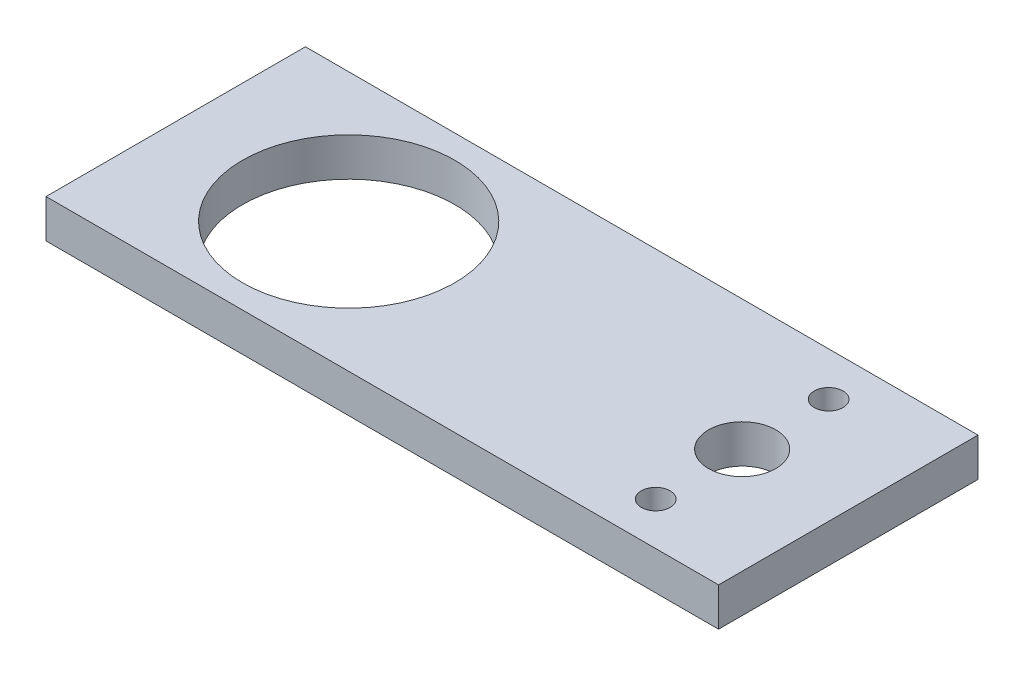
ISO-10303-21;
HEADER;
FILE_DESCRIPTION(('STEP AP214'),'2;1');
FILE_NAME('part.step','',(''),(''),'','','');
FILE_SCHEMA(('AUTOMOTIVE_DESIGN { 1 0 10303 214 1 1 1 1 }'));
ENDSEC;
DATA;
#1=APPLICATION_CONTEXT('core data for automotive mechanical design processes');
#2=APPLICATION_PROTOCOL_DEFINITION('international standard','automotive_design',2000,#1);
#3=PRODUCT_CONTEXT('',#1,'mechanical');
#4=PRODUCT('Part','Part','',(#3));
#5=PRODUCT_RELATED_PRODUCT_CATEGORY('part','',(#4));
#6=PRODUCT_DEFINITION_FORMATION('','',#4);
#7=PRODUCT_DEFINITION_CONTEXT('part definition',#1,'design');
#8=PRODUCT_DEFINITION('design','',#6,#7);
#9=PRODUCT_DEFINITION_SHAPE('','',#8);
#10=(LENGTH_UNIT() NAMED_UNIT(*) SI_UNIT(.MILLI.,.METRE.));
#11=(NAMED_UNIT(*) PLANE_ANGLE_UNIT() SI_UNIT($,.RADIAN.));
#12=(NAMED_UNIT(*) SI_UNIT($,.STERADIAN.) SOLID_ANGLE_UNIT());
#13=UNCERTAINTY_MEASURE_WITH_UNIT(LENGTH_MEASURE(1.E-05),#10,'distance_accuracy_value','');
#14=(GEOMETRIC_REPRESENTATION_CONTEXT(3) GLOBAL_UNCERTAINTY_ASSIGNED_CONTEXT((#13)) GLOBAL_UNIT_ASSIGNED_CONTEXT((#10,
#11,#12)) REPRESENTATION_CONTEXT('',''));
#15=CARTESIAN_POINT('',(0.,0.,0.));
#16=DIRECTION('',(0.,0.,1.));
#17=DIRECTION('',(1.,0.,0.));
#18=AXIS2_PLACEMENT_3D('',#15,#16,#17);
#19=CARTESIAN_POINT('',(0.,4.,0.));
#20=DIRECTION('',(0.,1.,0.));
#21=DIRECTION('',(0.,0.,1.));
#22=AXIS2_PLACEMENT_3D('',#19,#20,#21);
#23=PLANE('',#22);
#24=CARTESIAN_POINT('',(17.4049913423172,4.,11.6506590485616));
#25=DIRECTION('',(0.,1.,0.));
#26=DIRECTION('',(0.,0.,1.));
#27=AXIS2_PLACEMENT_3D('',#24,#25,#26);
#28=CIRCLE('',#27,1.5);
#29=CARTESIAN_POINT('',(17.4049913423172,4.,13.1506590485616));
#30=VERTEX_POINT('',#29);
#31=EDGE_CURVE('E142',#30,#30,#28,.T.);
#32=ORIENTED_EDGE('',*,*,#31,.F.);
#33=EDGE_LOOP('',(#32));
#34=FACE_BOUND('',#33,.T.);
#35=CARTESIAN_POINT('',(17.4049913423173,4.,2.65065904856156));
#36=DIRECTION('',(0.,1.,0.));
#37=DIRECTION('',(0.,0.,1.));
#38=AXIS2_PLACEMENT_3D('',#35,#36,#37);
#39=CIRCLE('',#38,3.5);
#40=CARTESIAN_POINT('',(17.4049913423173,4.,6.15065904856156));
#41=VERTEX_POINT('',#40);
#42=EDGE_CURVE('E112',#41,#41,#39,.T.);
#43=ORIENTED_EDGE('',*,*,#42,.F.);
#44=EDGE_LOOP('',(#43));
#45=FACE_BOUND('',#44,.T.);
#46=DIRECTION('',(0.,0.,1.));
#47=VECTOR('',#46,1.);
#48=CARTESIAN_POINT('',(-41.5950086576828,4.,-10.8941504178273));
#49=LINE('',#48,#47);
#50=CARTESIAN_POINT('',(-41.5950086576828,4.,-10.8941504178273));
#51=VERTEX_POINT('',#50);
#52=CARTESIAN_POINT('',(-41.5950086576828,4.,16.1058495821727));
#53=VERTEX_POINT('',#52);
#54=EDGE_CURVE('E92',#51,#53,#49,.T.);
#55=ORIENTED_EDGE('',*,*,#54,.T.);
#56=DIRECTION('',(1.,0.,0.));
#57=VECTOR('',#56,1.);
#58=CARTESIAN_POINT('',(-41.5950086576828,4.,16.1058495821727));
#59=LINE('',#58,#57);
#60=CARTESIAN_POINT('',(28.4049913423173,4.,16.1058495821727));
#61=VERTEX_POINT('',#60);
#62=EDGE_CURVE('E87',#53,#61,#59,.T.);
#63=ORIENTED_EDGE('',*,*,#62,.T.);
#64=DIRECTION('',(0.,0.,-1.));
#65=VECTOR('',#64,1.);
#66=CARTESIAN_POINT('',(28.4049913423173,4.,-10.8941504178273));
#67=LINE('',#66,#65);
#68=CARTESIAN_POINT('',(28.4049913423173,4.,-10.8941504178273));
#69=VERTEX_POINT('',#68);
#70=EDGE_CURVE('E90',#61,#69,#67,.T.);
#71=ORIENTED_EDGE('',*,*,#70,.T.);
#72=DIRECTION('',(-1.,0.,0.));
#73=VECTOR('',#72,1.);
#74=CARTESIAN_POINT('',(-41.5950086576828,4.,-10.8941504178273));
#75=LINE('',#74,#73);
#76=EDGE_CURVE('E57',#69,#51,#75,.T.);
#77=ORIENTED_EDGE('',*,*,#76,.T.);
#78=EDGE_LOOP('',(#55,#63,#71,#77));
#79=FACE_BOUND('',#78,.T.);
#80=CARTESIAN_POINT('',(17.4049913423172,4.,-6.34934095143844));
#81=DIRECTION('',(0.,1.,0.));
#82=DIRECTION('',(0.,0.,1.));
#83=AXIS2_PLACEMENT_3D('',#80,#81,#82);
#84=CIRCLE('',#83,1.5);
#85=CARTESIAN_POINT('',(17.4049913423172,4.,-4.84934095143844));
#86=VERTEX_POINT('',#85);
#87=EDGE_CURVE('E134',#86,#86,#84,.T.);
#88=ORIENTED_EDGE('',*,*,#87,.F.);
#89=EDGE_LOOP('',(#88));
#90=FACE_BOUND('',#89,.T.);
#91=CARTESIAN_POINT('',(-23.5950086576827,4.,2.6058495821727));
#92=DIRECTION('',(0.,1.,0.));
#93=DIRECTION('',(0.,0.,1.));
#94=AXIS2_PLACEMENT_3D('',#91,#92,#93);
#95=CIRCLE('',#94,11.05);
#96=CARTESIAN_POINT('',(-23.5950086576827,4.,13.6558495821727));
#97=VERTEX_POINT('',#96);
#98=EDGE_CURVE('E150',#97,#97,#95,.T.);
#99=ORIENTED_EDGE('',*,*,#98,.F.);
#100=EDGE_LOOP('',(#99));
#101=FACE_BOUND('',#100,.T.);
#102=ADVANCED_FACE('F39',(#34,#45,#79,#90,#101),#23,.T.);
#103=CARTESIAN_POINT('',(0.,0.,0.));
#104=DIRECTION('',(0.,1.,0.));
#105=DIRECTION('',(0.,0.,1.));
#106=AXIS2_PLACEMENT_3D('',#103,#104,#105);
#107=PLANE('',#106);
#108=DIRECTION('',(0.,0.,1.));
#109=VECTOR('',#108,1.);
#110=CARTESIAN_POINT('',(-41.5950086576828,0.,-10.8941504178273));
#111=LINE('',#110,#109);
#112=CARTESIAN_POINT('',(-41.5950086576828,0.,-10.8941504178273));
#113=VERTEX_POINT('',#112);
#114=CARTESIAN_POINT('',(-41.5950086576828,0.,16.1058495821727));
#115=VERTEX_POINT('',#114);
#116=EDGE_CURVE('E108',#113,#115,#111,.T.);
#117=ORIENTED_EDGE('',*,*,#116,.F.);
#118=DIRECTION('',(-1.,0.,0.));
#119=VECTOR('',#118,1.);
#120=CARTESIAN_POINT('',(-41.5950086576828,0.,-10.8941504178273));
#121=LINE('',#120,#119);
#122=CARTESIAN_POINT('',(28.4049913423173,0.,-10.8941504178273));
#123=VERTEX_POINT('',#122);
#124=EDGE_CURVE('E80',#123,#113,#121,.T.);
#125=ORIENTED_EDGE('',*,*,#124,.F.);
#126=DIRECTION('',(0.,0.,-1.));
#127=VECTOR('',#126,1.);
#128=CARTESIAN_POINT('',(28.4049913423173,0.,-10.8941504178273));
#129=LINE('',#128,#127);
#130=CARTESIAN_POINT('',(28.4049913423173,0.,16.1058495821727));
#131=VERTEX_POINT('',#130);
#132=EDGE_CURVE('E74',#131,#123,#129,.T.);
#133=ORIENTED_EDGE('',*,*,#132,.F.);
#134=DIRECTION('',(1.,0.,0.));
#135=VECTOR('',#134,1.);
#136=CARTESIAN_POINT('',(-41.5950086576828,0.,16.1058495821727));
#137=LINE('',#136,#135);
#138=EDGE_CURVE('E97',#115,#131,#137,.T.);
#139=ORIENTED_EDGE('',*,*,#138,.F.);
#140=EDGE_LOOP('',(#117,#125,#133,#139));
#141=FACE_BOUND('',#140,.T.);
#142=CARTESIAN_POINT('',(17.4049913423173,0.,2.65065904856156));
#143=DIRECTION('',(0.,1.,0.));
#144=DIRECTION('',(0.,0.,1.));
#145=AXIS2_PLACEMENT_3D('',#142,#143,#144);
#146=CIRCLE('',#145,3.5);
#147=CARTESIAN_POINT('',(17.4049913423173,0.,6.15065904856156));
#148=VERTEX_POINT('',#147);
#149=EDGE_CURVE('E130',#148,#148,#146,.T.);
#150=ORIENTED_EDGE('',*,*,#149,.T.);
#151=EDGE_LOOP('',(#150));
#152=FACE_BOUND('',#151,.T.);
#153=CARTESIAN_POINT('',(17.4049913423172,0.,-6.34934095143844));
#154=DIRECTION('',(0.,1.,0.));
#155=DIRECTION('',(0.,0.,1.));
#156=AXIS2_PLACEMENT_3D('',#153,#154,#155);
#157=CIRCLE('',#156,1.5);
#158=CARTESIAN_POINT('',(17.4049913423172,0.,-4.84934095143844));
#159=VERTEX_POINT('',#158);
#160=EDGE_CURVE('E138',#159,#159,#157,.T.);
#161=ORIENTED_EDGE('',*,*,#160,.T.);
#162=EDGE_LOOP('',(#161));
#163=FACE_BOUND('',#162,.T.);
#164=CARTESIAN_POINT('',(17.4049913423172,0.,11.6506590485616));
#165=DIRECTION('',(0.,1.,0.));
#166=DIRECTION('',(0.,0.,1.));
#167=AXIS2_PLACEMENT_3D('',#164,#165,#166);
#168=CIRCLE('',#167,1.5);
#169=CARTESIAN_POINT('',(17.4049913423172,0.,13.1506590485616));
#170=VERTEX_POINT('',#169);
#171=EDGE_CURVE('E146',#170,#170,#168,.T.);
#172=ORIENTED_EDGE('',*,*,#171,.T.);
#173=EDGE_LOOP('',(#172));
#174=FACE_BOUND('',#173,.T.);
#175=CARTESIAN_POINT('',(-23.5950086576827,0.,2.6058495821727));
#176=DIRECTION('',(0.,1.,0.));
#177=DIRECTION('',(0.,0.,1.));
#178=AXIS2_PLACEMENT_3D('',#175,#176,#177);
#179=CIRCLE('',#178,11.05);
#180=CARTESIAN_POINT('',(-23.5950086576827,0.,13.6558495821727));
#181=VERTEX_POINT('',#180);
#182=EDGE_CURVE('E154',#181,#181,#179,.T.);
#183=ORIENTED_EDGE('',*,*,#182,.T.);
#184=EDGE_LOOP('',(#183));
#185=FACE_BOUND('',#184,.T.);
#186=ADVANCED_FACE('F125',(#141,#152,#163,#174,#185),#107,.F.);
#187=CARTESIAN_POINT('',(-41.5950086576828,4.,-10.8941504178273));
#188=DIRECTION('',(1.,0.,0.));
#189=DIRECTION('',(0.,0.,-1.));
#190=AXIS2_PLACEMENT_3D('',#187,#188,#189);
#191=PLANE('',#190);
#192=ORIENTED_EDGE('',*,*,#116,.T.);
#193=DIRECTION('',(0.,-1.,0.));
#194=VECTOR('',#193,1.);
#195=CARTESIAN_POINT('',(-41.5950086576828,4.,16.1058495821727));
#196=LINE('',#195,#194);
#197=EDGE_CURVE('E11',#53,#115,#196,.T.);
#198=ORIENTED_EDGE('',*,*,#197,.F.);
#199=ORIENTED_EDGE('',*,*,#54,.F.);
#200=DIRECTION('',(0.,-1.,0.));
#201=VECTOR('',#200,1.);
#202=CARTESIAN_POINT('',(-41.5950086576828,4.,-10.8941504178273));
#203=LINE('',#202,#201);
#204=EDGE_CURVE('E104',#51,#113,#203,.T.);
#205=ORIENTED_EDGE('',*,*,#204,.T.);
#206=EDGE_LOOP('',(#192,#198,#199,#205));
#207=FACE_BOUND('',#206,.T.);
#208=ADVANCED_FACE('F41',(#207),#191,.F.);
#209=CARTESIAN_POINT('',(-41.5950086576828,4.,16.1058495821727));
#210=DIRECTION('',(0.,0.,-1.));
#211=DIRECTION('',(-1.,0.,0.));
#212=AXIS2_PLACEMENT_3D('',#209,#210,#211);
#213=PLANE('',#212);
#214=ORIENTED_EDGE('',*,*,#138,.T.);
#215=DIRECTION('',(0.,-1.,0.));
#216=VECTOR('',#215,1.);
#217=CARTESIAN_POINT('',(28.4049913423173,4.,16.1058495821727));
#218=LINE('',#217,#216);
#219=EDGE_CURVE('E49',#61,#131,#218,.T.);
#220=ORIENTED_EDGE('',*,*,#219,.F.);
#221=ORIENTED_EDGE('',*,*,#62,.F.);
#222=ORIENTED_EDGE('',*,*,#197,.T.);
#223=EDGE_LOOP('',(#214,#220,#221,#222));
#224=FACE_BOUND('',#223,.T.);
#225=ADVANCED_FACE('F96',(#224),#213,.F.);
#226=CARTESIAN_POINT('',(28.4049913423173,4.,-10.8941504178273));
#227=DIRECTION('',(-1.,0.,0.));
#228=DIRECTION('',(0.,0.,1.));
#229=AXIS2_PLACEMENT_3D('',#226,#227,#228);
#230=PLANE('',#229);
#231=ORIENTED_EDGE('',*,*,#132,.T.);
#232=DIRECTION('',(0.,-1.,0.));
#233=VECTOR('',#232,1.);
#234=CARTESIAN_POINT('',(28.4049913423173,4.,-10.8941504178273));
#235=LINE('',#234,#233);
#236=EDGE_CURVE('E99',#69,#123,#235,.T.);
#237=ORIENTED_EDGE('',*,*,#236,.F.);
#238=ORIENTED_EDGE('',*,*,#70,.F.);
#239=ORIENTED_EDGE('',*,*,#219,.T.);
#240=EDGE_LOOP('',(#231,#237,#238,#239));
#241=FACE_BOUND('',#240,.T.);
#242=ADVANCED_FACE('F100',(#241),#230,.F.);
#243=CARTESIAN_POINT('',(-41.5950086576828,4.,-10.8941504178273));
#244=DIRECTION('',(0.,0.,1.));
#245=DIRECTION('',(1.,0.,0.));
#246=AXIS2_PLACEMENT_3D('',#243,#244,#245);
#247=PLANE('',#246);
#248=ORIENTED_EDGE('',*,*,#124,.T.);
#249=ORIENTED_EDGE('',*,*,#204,.F.);
#250=ORIENTED_EDGE('',*,*,#76,.F.);
#251=ORIENTED_EDGE('',*,*,#236,.T.);
#252=EDGE_LOOP('',(#248,#249,#250,#251));
#253=FACE_BOUND('',#252,.T.);
#254=ADVANCED_FACE('F122',(#253),#247,.F.);
#255=CARTESIAN_POINT('',(17.4049913423173,4.,2.65065904856156));
#256=DIRECTION('',(0.,-1.,0.));
#257=DIRECTION('',(0.,0.,-1.));
#258=AXIS2_PLACEMENT_3D('',#255,#256,#257);
#259=CYLINDRICAL_SURFACE('',#258,3.5);
#260=ORIENTED_EDGE('',*,*,#42,.T.);
#261=EDGE_LOOP('',(#260));
#262=FACE_BOUND('',#261,.T.);
#263=ORIENTED_EDGE('',*,*,#149,.F.);
#264=EDGE_LOOP('',(#263));
#265=FACE_BOUND('',#264,.T.);
#266=ADVANCED_FACE('F175',(#262,#265),#259,.F.);
#267=CARTESIAN_POINT('',(17.4049913423172,4.,-6.34934095143844));
#268=DIRECTION('',(0.,-1.,0.));
#269=DIRECTION('',(0.,0.,-1.));
#270=AXIS2_PLACEMENT_3D('',#267,#268,#269);
#271=CYLINDRICAL_SURFACE('',#270,1.5);
#272=ORIENTED_EDGE('',*,*,#87,.T.);
#273=EDGE_LOOP('',(#272));
#274=FACE_BOUND('',#273,.T.);
#275=ORIENTED_EDGE('',*,*,#160,.F.);
#276=EDGE_LOOP('',(#275));
#277=FACE_BOUND('',#276,.T.);
#278=ADVANCED_FACE('F221',(#274,#277),#271,.F.);
#279=CARTESIAN_POINT('',(17.4049913423172,4.,11.6506590485616));
#280=DIRECTION('',(0.,-1.,0.));
#281=DIRECTION('',(0.,0.,-1.));
#282=AXIS2_PLACEMENT_3D('',#279,#280,#281);
#283=CYLINDRICAL_SURFACE('',#282,1.5);
#284=ORIENTED_EDGE('',*,*,#31,.T.);
#285=EDGE_LOOP('',(#284));
#286=FACE_BOUND('',#285,.T.);
#287=ORIENTED_EDGE('',*,*,#171,.F.);
#288=EDGE_LOOP('',(#287));
#289=FACE_BOUND('',#288,.T.);
#290=ADVANCED_FACE('F229',(#286,#289),#283,.F.);
#291=CARTESIAN_POINT('',(-23.5950086576827,4.,2.6058495821727));
#292=DIRECTION('',(0.,-1.,0.));
#293=DIRECTION('',(0.,0.,-1.));
#294=AXIS2_PLACEMENT_3D('',#291,#292,#293);
#295=CYLINDRICAL_SURFACE('',#294,11.05);
#296=ORIENTED_EDGE('',*,*,#98,.T.);
#297=EDGE_LOOP('',(#296));
#298=FACE_BOUND('',#297,.T.);
#299=ORIENTED_EDGE('',*,*,#182,.F.);
#300=EDGE_LOOP('',(#299));
#301=FACE_BOUND('',#300,.T.);
#302=ADVANCED_FACE('F162',(#298,#301),#295,.F.);
#303=CLOSED_SHELL('',(#102,#186,#208,#225,#242,#254,#266,#278,#290,#302));
#304=MANIFOLD_SOLID_BREP('B2',#303);
#305=ADVANCED_BREP_SHAPE_REPRESENTATION('',(#18,#304),#14);
#306=SHAPE_DEFINITION_REPRESENTATION(#9,#305);
ENDSEC;
END-ISO-10303-21;
